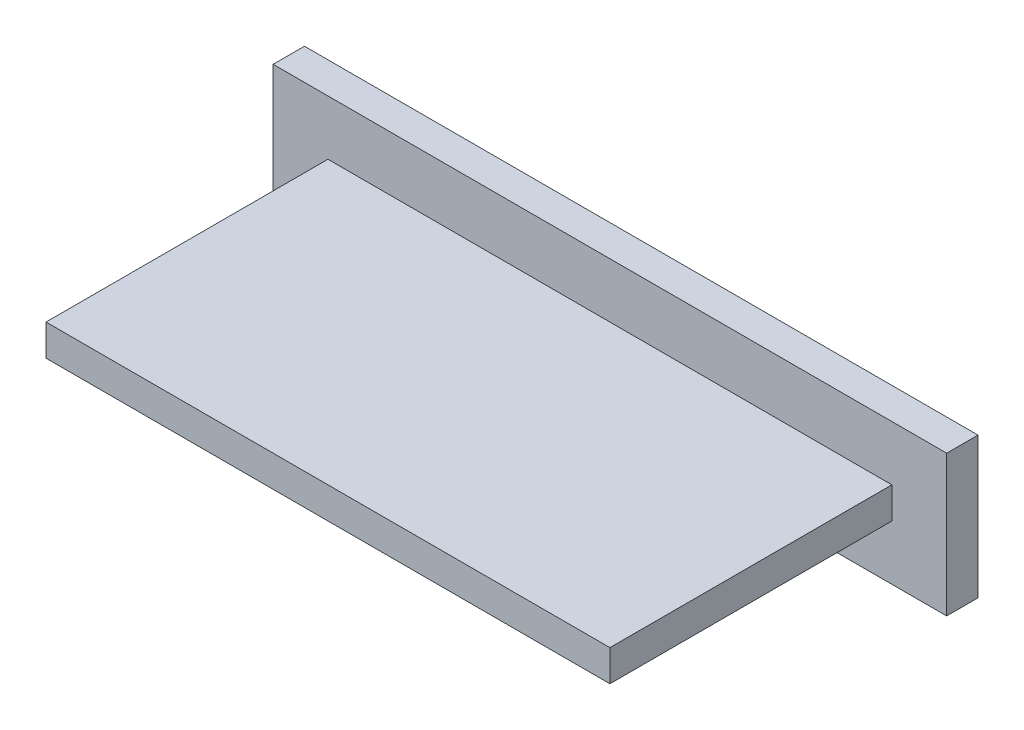
ISO-10303-21;
HEADER;
FILE_DESCRIPTION(('STEP AP214'),'2;1');
FILE_NAME('part.step','',(''),(''),'','','');
FILE_SCHEMA(('AUTOMOTIVE_DESIGN { 1 0 10303 214 1 1 1 1 }'));
ENDSEC;
DATA;
#1=APPLICATION_CONTEXT('core data for automotive mechanical design processes');
#2=APPLICATION_PROTOCOL_DEFINITION('international standard','automotive_design',2000,#1);
#3=PRODUCT_CONTEXT('',#1,'mechanical');
#4=PRODUCT('Part','Part','',(#3));
#5=PRODUCT_RELATED_PRODUCT_CATEGORY('part','',(#4));
#6=PRODUCT_DEFINITION_FORMATION('','',#4);
#7=PRODUCT_DEFINITION_CONTEXT('part definition',#1,'design');
#8=PRODUCT_DEFINITION('design','',#6,#7);
#9=PRODUCT_DEFINITION_SHAPE('','',#8);
#10=(LENGTH_UNIT() NAMED_UNIT(*) SI_UNIT(.MILLI.,.METRE.));
#11=(NAMED_UNIT(*) PLANE_ANGLE_UNIT() SI_UNIT($,.RADIAN.));
#12=(NAMED_UNIT(*) SI_UNIT($,.STERADIAN.) SOLID_ANGLE_UNIT());
#13=UNCERTAINTY_MEASURE_WITH_UNIT(LENGTH_MEASURE(1.E-05),#10,'distance_accuracy_value','');
#14=(GEOMETRIC_REPRESENTATION_CONTEXT(3) GLOBAL_UNCERTAINTY_ASSIGNED_CONTEXT((#13)) GLOBAL_UNIT_ASSIGNED_CONTEXT((#10,
#11,#12)) REPRESENTATION_CONTEXT('',''));
#15=CARTESIAN_POINT('',(0.,0.,0.));
#16=DIRECTION('',(0.,0.,1.));
#17=DIRECTION('',(1.,0.,0.));
#18=AXIS2_PLACEMENT_3D('',#15,#16,#17);
#19=CARTESIAN_POINT('',(0.,0.,4.));
#20=DIRECTION('',(0.,0.,1.));
#21=DIRECTION('',(1.,0.,0.));
#22=AXIS2_PLACEMENT_3D('',#19,#20,#21);
#23=PLANE('',#22);
#24=DIRECTION('',(0.,-1.,0.));
#25=VECTOR('',#24,1.);
#26=CARTESIAN_POINT('',(0.,0.,4.));
#27=LINE('',#26,#25);
#28=CARTESIAN_POINT('',(0.,0.,4.));
#29=VERTEX_POINT('',#28);
#30=CARTESIAN_POINT('',(0.,-18.,4.));
#31=VERTEX_POINT('',#30);
#32=EDGE_CURVE('E140',#29,#31,#27,.T.);
#33=ORIENTED_EDGE('',*,*,#32,.T.);
#34=DIRECTION('',(1.,0.,0.));
#35=VECTOR('',#34,1.);
#36=CARTESIAN_POINT('',(0.,-18.,4.));
#37=LINE('',#36,#35);
#38=CARTESIAN_POINT('',(86.,-18.,4.));
#39=VERTEX_POINT('',#38);
#40=EDGE_CURVE('E85',#31,#39,#37,.T.);
#41=ORIENTED_EDGE('',*,*,#40,.T.);
#42=DIRECTION('',(0.,1.,0.));
#43=VECTOR('',#42,1.);
#44=CARTESIAN_POINT('',(86.,0.,4.));
#45=LINE('',#44,#43);
#46=CARTESIAN_POINT('',(86.,0.,4.));
#47=VERTEX_POINT('',#46);
#48=EDGE_CURVE('E143',#39,#47,#45,.T.);
#49=ORIENTED_EDGE('',*,*,#48,.T.);
#50=DIRECTION('',(-1.,0.,0.));
#51=VECTOR('',#50,1.);
#52=CARTESIAN_POINT('',(0.,0.,4.));
#53=LINE('',#52,#51);
#54=EDGE_CURVE('E57',#47,#29,#53,.T.);
#55=ORIENTED_EDGE('',*,*,#54,.T.);
#56=EDGE_LOOP('',(#33,#41,#49,#55));
#57=FACE_BOUND('',#56,.T.);
#58=DIRECTION('',(1.,0.,0.));
#59=VECTOR('',#58,1.);
#60=CARTESIAN_POINT('',(79.,-11.,4.));
#61=LINE('',#60,#59);
#62=CARTESIAN_POINT('',(7.,-11.,4.));
#63=VERTEX_POINT('',#62);
#64=CARTESIAN_POINT('',(79.,-11.,4.));
#65=VERTEX_POINT('',#64);
#66=EDGE_CURVE('E263',#63,#65,#61,.T.);
#67=ORIENTED_EDGE('',*,*,#66,.F.);
#68=DIRECTION('',(0.,-1.,0.));
#69=VECTOR('',#68,1.);
#70=CARTESIAN_POINT('',(7.,-11.,4.));
#71=LINE('',#70,#69);
#72=CARTESIAN_POINT('',(7.,-7.,4.));
#73=VERTEX_POINT('',#72);
#74=EDGE_CURVE('E130',#73,#63,#71,.T.);
#75=ORIENTED_EDGE('',*,*,#74,.F.);
#76=DIRECTION('',(-1.,0.,0.));
#77=VECTOR('',#76,1.);
#78=CARTESIAN_POINT('',(7.,-7.,4.));
#79=LINE('',#78,#77);
#80=CARTESIAN_POINT('',(79.,-7.,4.));
#81=VERTEX_POINT('',#80);
#82=EDGE_CURVE('E126',#81,#73,#79,.T.);
#83=ORIENTED_EDGE('',*,*,#82,.F.);
#84=DIRECTION('',(0.,1.,0.));
#85=VECTOR('',#84,1.);
#86=CARTESIAN_POINT('',(79.,-7.,4.));
#87=LINE('',#86,#85);
#88=EDGE_CURVE('E260',#65,#81,#87,.T.);
#89=ORIENTED_EDGE('',*,*,#88,.F.);
#90=EDGE_LOOP('',(#67,#75,#83,#89));
#91=FACE_BOUND('',#90,.T.);
#92=ADVANCED_FACE('F33',(#57,#91),#23,.T.);
#93=CARTESIAN_POINT('',(0.,0.,4.));
#94=DIRECTION('',(1.,0.,0.));
#95=DIRECTION('',(0.,1.,0.));
#96=AXIS2_PLACEMENT_3D('',#93,#94,#95);
#97=PLANE('',#96);
#98=DIRECTION('',(0.,-1.,0.));
#99=VECTOR('',#98,1.);
#100=CARTESIAN_POINT('',(0.,0.,0.));
#101=LINE('',#100,#99);
#102=CARTESIAN_POINT('',(0.,0.,0.));
#103=VERTEX_POINT('',#102);
#104=CARTESIAN_POINT('',(0.,-18.,0.));
#105=VERTEX_POINT('',#104);
#106=EDGE_CURVE('E132',#103,#105,#101,.T.);
#107=ORIENTED_EDGE('',*,*,#106,.T.);
#108=DIRECTION('',(0.,0.,-1.));
#109=VECTOR('',#108,1.);
#110=CARTESIAN_POINT('',(0.,-18.,4.));
#111=LINE('',#110,#109);
#112=EDGE_CURVE('E11',#31,#105,#111,.T.);
#113=ORIENTED_EDGE('',*,*,#112,.F.);
#114=ORIENTED_EDGE('',*,*,#32,.F.);
#115=DIRECTION('',(0.,0.,-1.));
#116=VECTOR('',#115,1.);
#117=CARTESIAN_POINT('',(0.,0.,4.));
#118=LINE('',#117,#116);
#119=EDGE_CURVE('E145',#29,#103,#118,.T.);
#120=ORIENTED_EDGE('',*,*,#119,.T.);
#121=EDGE_LOOP('',(#107,#113,#114,#120));
#122=FACE_BOUND('',#121,.T.);
#123=ADVANCED_FACE('F35',(#122),#97,.F.);
#124=CARTESIAN_POINT('',(0.,-18.,4.));
#125=DIRECTION('',(0.,1.,0.));
#126=DIRECTION('',(0.,0.,1.));
#127=AXIS2_PLACEMENT_3D('',#124,#125,#126);
#128=PLANE('',#127);
#129=DIRECTION('',(1.,0.,0.));
#130=VECTOR('',#129,1.);
#131=CARTESIAN_POINT('',(0.,-18.,0.));
#132=LINE('',#131,#130);
#133=CARTESIAN_POINT('',(86.,-18.,0.));
#134=VERTEX_POINT('',#133);
#135=EDGE_CURVE('E135',#105,#134,#132,.T.);
#136=ORIENTED_EDGE('',*,*,#135,.T.);
#137=DIRECTION('',(0.,0.,-1.));
#138=VECTOR('',#137,1.);
#139=CARTESIAN_POINT('',(86.,-18.,4.));
#140=LINE('',#139,#138);
#141=EDGE_CURVE('E41',#39,#134,#140,.T.);
#142=ORIENTED_EDGE('',*,*,#141,.F.);
#143=ORIENTED_EDGE('',*,*,#40,.F.);
#144=ORIENTED_EDGE('',*,*,#112,.T.);
#145=EDGE_LOOP('',(#136,#142,#143,#144));
#146=FACE_BOUND('',#145,.T.);
#147=ADVANCED_FACE('F173',(#146),#128,.F.);
#148=CARTESIAN_POINT('',(86.,0.,4.));
#149=DIRECTION('',(-1.,0.,0.));
#150=DIRECTION('',(0.,0.,1.));
#151=AXIS2_PLACEMENT_3D('',#148,#149,#150);
#152=PLANE('',#151);
#153=DIRECTION('',(0.,1.,0.));
#154=VECTOR('',#153,1.);
#155=CARTESIAN_POINT('',(86.,0.,0.));
#156=LINE('',#155,#154);
#157=CARTESIAN_POINT('',(86.,0.,0.));
#158=VERTEX_POINT('',#157);
#159=EDGE_CURVE('E148',#134,#158,#156,.T.);
#160=ORIENTED_EDGE('',*,*,#159,.T.);
#161=DIRECTION('',(0.,0.,-1.));
#162=VECTOR('',#161,1.);
#163=CARTESIAN_POINT('',(86.,0.,4.));
#164=LINE('',#163,#162);
#165=EDGE_CURVE('E152',#47,#158,#164,.T.);
#166=ORIENTED_EDGE('',*,*,#165,.F.);
#167=ORIENTED_EDGE('',*,*,#48,.F.);
#168=ORIENTED_EDGE('',*,*,#141,.T.);
#169=EDGE_LOOP('',(#160,#166,#167,#168));
#170=FACE_BOUND('',#169,.T.);
#171=ADVANCED_FACE('F157',(#170),#152,.F.);
#172=CARTESIAN_POINT('',(0.,0.,4.));
#173=DIRECTION('',(0.,-1.,0.));
#174=DIRECTION('',(0.,0.,-1.));
#175=AXIS2_PLACEMENT_3D('',#172,#173,#174);
#176=PLANE('',#175);
#177=DIRECTION('',(-1.,0.,0.));
#178=VECTOR('',#177,1.);
#179=CARTESIAN_POINT('',(0.,0.,0.));
#180=LINE('',#179,#178);
#181=EDGE_CURVE('E78',#158,#103,#180,.T.);
#182=ORIENTED_EDGE('',*,*,#181,.T.);
#183=ORIENTED_EDGE('',*,*,#119,.F.);
#184=ORIENTED_EDGE('',*,*,#54,.F.);
#185=ORIENTED_EDGE('',*,*,#165,.T.);
#186=EDGE_LOOP('',(#182,#183,#184,#185));
#187=FACE_BOUND('',#186,.T.);
#188=ADVANCED_FACE('F165',(#187),#176,.F.);
#189=CARTESIAN_POINT('',(0.,0.,0.));
#190=DIRECTION('',(0.,0.,1.));
#191=DIRECTION('',(1.,0.,0.));
#192=AXIS2_PLACEMENT_3D('',#189,#190,#191);
#193=PLANE('',#192);
#194=ORIENTED_EDGE('',*,*,#106,.F.);
#195=ORIENTED_EDGE('',*,*,#181,.F.);
#196=ORIENTED_EDGE('',*,*,#159,.F.);
#197=ORIENTED_EDGE('',*,*,#135,.F.);
#198=EDGE_LOOP('',(#194,#195,#196,#197));
#199=FACE_BOUND('',#198,.T.);
#200=ADVANCED_FACE('F161',(#199),#193,.F.);
#201=CARTESIAN_POINT('',(7.,-11.,40.));
#202=DIRECTION('',(1.,0.,0.));
#203=DIRECTION('',(0.,0.,-1.));
#204=AXIS2_PLACEMENT_3D('',#201,#202,#203);
#205=PLANE('',#204);
#206=ORIENTED_EDGE('',*,*,#74,.T.);
#207=DIRECTION('',(0.,0.,-1.));
#208=VECTOR('',#207,1.);
#209=CARTESIAN_POINT('',(7.,-11.,40.));
#210=LINE('',#209,#208);
#211=CARTESIAN_POINT('',(7.,-11.,40.));
#212=VERTEX_POINT('',#211);
#213=EDGE_CURVE('E111',#212,#63,#210,.T.);
#214=ORIENTED_EDGE('',*,*,#213,.F.);
#215=DIRECTION('',(0.,-1.,0.));
#216=VECTOR('',#215,1.);
#217=CARTESIAN_POINT('',(7.,-11.,40.));
#218=LINE('',#217,#216);
#219=CARTESIAN_POINT('',(7.,-7.,40.));
#220=VERTEX_POINT('',#219);
#221=EDGE_CURVE('E118',#220,#212,#218,.T.);
#222=ORIENTED_EDGE('',*,*,#221,.F.);
#223=DIRECTION('',(0.,0.,-1.));
#224=VECTOR('',#223,1.);
#225=CARTESIAN_POINT('',(7.,-7.,40.));
#226=LINE('',#225,#224);
#227=EDGE_CURVE('E258',#220,#73,#226,.T.);
#228=ORIENTED_EDGE('',*,*,#227,.T.);
#229=EDGE_LOOP('',(#206,#214,#222,#228));
#230=FACE_BOUND('',#229,.T.);
#231=ADVANCED_FACE('F128',(#230),#205,.F.);
#232=CARTESIAN_POINT('',(79.,-11.,40.));
#233=DIRECTION('',(0.,1.,0.));
#234=DIRECTION('',(0.,0.,1.));
#235=AXIS2_PLACEMENT_3D('',#232,#233,#234);
#236=PLANE('',#235);
#237=ORIENTED_EDGE('',*,*,#66,.T.);
#238=DIRECTION('',(0.,0.,-1.));
#239=VECTOR('',#238,1.);
#240=CARTESIAN_POINT('',(79.,-11.,40.));
#241=LINE('',#240,#239);
#242=CARTESIAN_POINT('',(79.,-11.,40.));
#243=VERTEX_POINT('',#242);
#244=EDGE_CURVE('E114',#243,#65,#241,.T.);
#245=ORIENTED_EDGE('',*,*,#244,.F.);
#246=DIRECTION('',(1.,0.,0.));
#247=VECTOR('',#246,1.);
#248=CARTESIAN_POINT('',(79.,-11.,40.));
#249=LINE('',#248,#247);
#250=EDGE_CURVE('E107',#212,#243,#249,.T.);
#251=ORIENTED_EDGE('',*,*,#250,.F.);
#252=ORIENTED_EDGE('',*,*,#213,.T.);
#253=EDGE_LOOP('',(#237,#245,#251,#252));
#254=FACE_BOUND('',#253,.T.);
#255=ADVANCED_FACE('F109',(#254),#236,.F.);
#256=CARTESIAN_POINT('',(79.,-7.,40.));
#257=DIRECTION('',(-1.,0.,0.));
#258=DIRECTION('',(0.,0.,1.));
#259=AXIS2_PLACEMENT_3D('',#256,#257,#258);
#260=PLANE('',#259);
#261=ORIENTED_EDGE('',*,*,#88,.T.);
#262=DIRECTION('',(0.,0.,-1.));
#263=VECTOR('',#262,1.);
#264=CARTESIAN_POINT('',(79.,-7.,40.));
#265=LINE('',#264,#263);
#266=CARTESIAN_POINT('',(79.,-7.,40.));
#267=VERTEX_POINT('',#266);
#268=EDGE_CURVE('E48',#267,#81,#265,.T.);
#269=ORIENTED_EDGE('',*,*,#268,.F.);
#270=DIRECTION('',(0.,1.,0.));
#271=VECTOR('',#270,1.);
#272=CARTESIAN_POINT('',(79.,-7.,40.));
#273=LINE('',#272,#271);
#274=EDGE_CURVE('E117',#243,#267,#273,.T.);
#275=ORIENTED_EDGE('',*,*,#274,.F.);
#276=ORIENTED_EDGE('',*,*,#244,.T.);
#277=EDGE_LOOP('',(#261,#269,#275,#276));
#278=FACE_BOUND('',#277,.T.);
#279=ADVANCED_FACE('F186',(#278),#260,.F.);
#280=CARTESIAN_POINT('',(7.,-7.,40.));
#281=DIRECTION('',(0.,-1.,0.));
#282=DIRECTION('',(1.,0.,0.));
#283=AXIS2_PLACEMENT_3D('',#280,#281,#282);
#284=PLANE('',#283);
#285=ORIENTED_EDGE('',*,*,#82,.T.);
#286=ORIENTED_EDGE('',*,*,#227,.F.);
#287=DIRECTION('',(-1.,0.,0.));
#288=VECTOR('',#287,1.);
#289=CARTESIAN_POINT('',(7.,-7.,40.));
#290=LINE('',#289,#288);
#291=EDGE_CURVE('E122',#267,#220,#290,.T.);
#292=ORIENTED_EDGE('',*,*,#291,.F.);
#293=ORIENTED_EDGE('',*,*,#268,.T.);
#294=EDGE_LOOP('',(#285,#286,#292,#293));
#295=FACE_BOUND('',#294,.T.);
#296=ADVANCED_FACE('F189',(#295),#284,.F.);
#297=CARTESIAN_POINT('',(0.,0.,40.));
#298=DIRECTION('',(0.,0.,-1.));
#299=DIRECTION('',(-1.,0.,0.));
#300=AXIS2_PLACEMENT_3D('',#297,#298,#299);
#301=PLANE('',#300);
#302=ORIENTED_EDGE('',*,*,#221,.T.);
#303=ORIENTED_EDGE('',*,*,#250,.T.);
#304=ORIENTED_EDGE('',*,*,#274,.T.);
#305=ORIENTED_EDGE('',*,*,#291,.T.);
#306=EDGE_LOOP('',(#302,#303,#304,#305));
#307=FACE_BOUND('',#306,.T.);
#308=ADVANCED_FACE('F121',(#307),#301,.F.);
#309=CLOSED_SHELL('',(#92,#123,#147,#171,#188,#200,#231,#255,#279,#296,#308));
#310=MANIFOLD_SOLID_BREP('B2',#309);
#311=ADVANCED_BREP_SHAPE_REPRESENTATION('',(#18,#310),#14);
#312=SHAPE_DEFINITION_REPRESENTATION(#9,#311);
ENDSEC;
END-ISO-10303-21;
